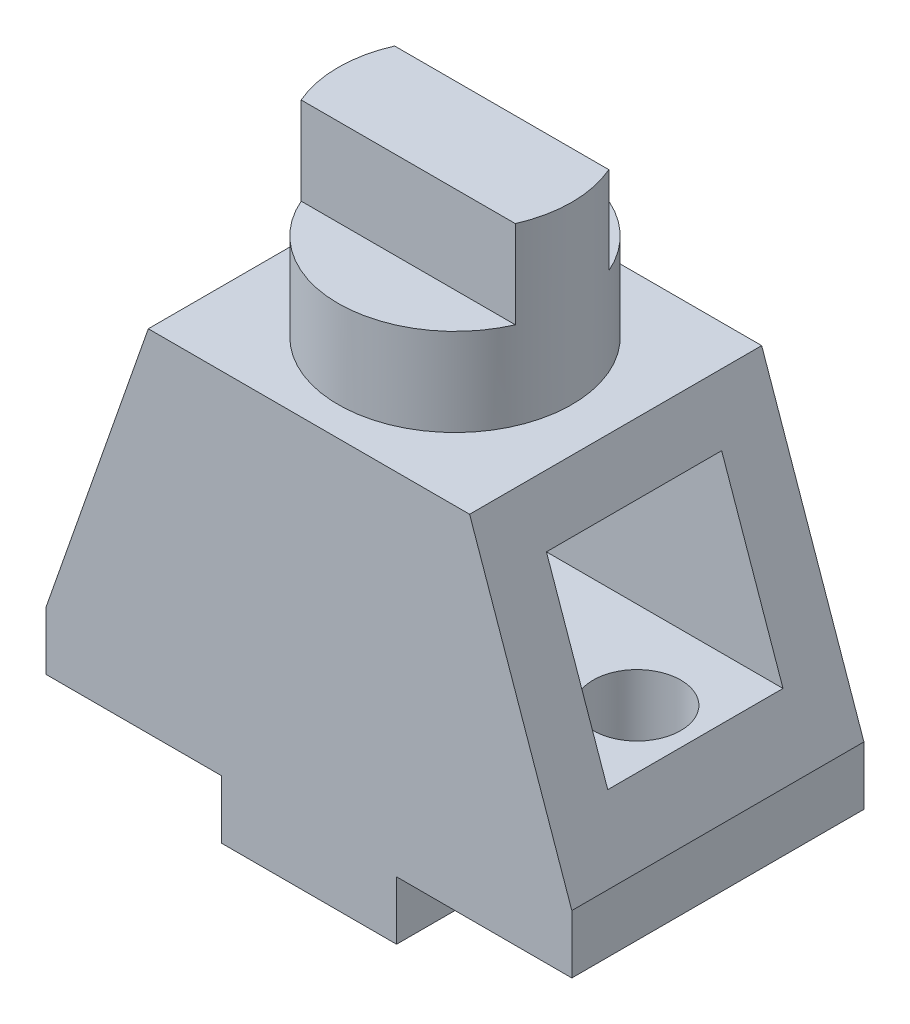
ISO-10303-21;
HEADER;
FILE_DESCRIPTION(('STEP AP214'),'2;1');
FILE_NAME('part.step','',(''),(''),'','','');
FILE_SCHEMA(('AUTOMOTIVE_DESIGN { 1 0 10303 214 1 1 1 1 }'));
ENDSEC;
DATA;
#1=APPLICATION_CONTEXT('core data for automotive mechanical design processes');
#2=APPLICATION_PROTOCOL_DEFINITION('international standard','automotive_design',2000,#1);
#3=PRODUCT_CONTEXT('',#1,'mechanical');
#4=PRODUCT('Part','Part','',(#3));
#5=PRODUCT_RELATED_PRODUCT_CATEGORY('part','',(#4));
#6=PRODUCT_DEFINITION_FORMATION('','',#4);
#7=PRODUCT_DEFINITION_CONTEXT('part definition',#1,'design');
#8=PRODUCT_DEFINITION('design','',#6,#7);
#9=PRODUCT_DEFINITION_SHAPE('','',#8);
#10=(LENGTH_UNIT() NAMED_UNIT(*) SI_UNIT(.MILLI.,.METRE.));
#11=(NAMED_UNIT(*) PLANE_ANGLE_UNIT() SI_UNIT($,.RADIAN.));
#12=(NAMED_UNIT(*) SI_UNIT($,.STERADIAN.) SOLID_ANGLE_UNIT());
#13=UNCERTAINTY_MEASURE_WITH_UNIT(LENGTH_MEASURE(1.E-05),#10,'distance_accuracy_value','');
#14=(GEOMETRIC_REPRESENTATION_CONTEXT(3) GLOBAL_UNCERTAINTY_ASSIGNED_CONTEXT((#13)) GLOBAL_UNIT_ASSIGNED_CONTEXT((#10,
#11,#12)) REPRESENTATION_CONTEXT('',''));
#15=CARTESIAN_POINT('',(0.,0.,0.));
#16=DIRECTION('',(0.,0.,1.));
#17=DIRECTION('',(1.,0.,0.));
#18=AXIS2_PLACEMENT_3D('',#15,#16,#17);
#19=CARTESIAN_POINT('',(0.,100.,25.));
#20=DIRECTION('',(0.,-1.,0.));
#21=DIRECTION('',(0.,0.,-1.));
#22=AXIS2_PLACEMENT_3D('',#19,#20,#21);
#23=CYLINDRICAL_SURFACE('',#22,20.);
#24=CARTESIAN_POINT('',(0.,70.,25.));
#25=DIRECTION('',(0.,-1.,0.));
#26=DIRECTION('',(0.,0.,-1.));
#27=AXIS2_PLACEMENT_3D('',#24,#25,#26);
#28=CIRCLE('',#27,20.);
#29=CARTESIAN_POINT('',(0.,70.,5.));
#30=VERTEX_POINT('',#29);
#31=EDGE_CURVE('E11',#30,#30,#28,.F.);
#32=ORIENTED_EDGE('',*,*,#31,.T.);
#33=EDGE_LOOP('',(#32));
#34=FACE_BOUND('',#33,.T.);
#35=DIRECTION('',(0.,1.,0.));
#36=VECTOR('',#35,1.);
#37=CARTESIAN_POINT('',(-18.3303027798234,85.,33.));
#38=LINE('',#37,#36);
#39=CARTESIAN_POINT('',(-18.3303027798234,85.,33.));
#40=VERTEX_POINT('',#39);
#41=CARTESIAN_POINT('',(-18.3303027798234,100.,33.));
#42=VERTEX_POINT('',#41);
#43=EDGE_CURVE('E158',#40,#42,#38,.T.);
#44=ORIENTED_EDGE('',*,*,#43,.T.);
#45=CARTESIAN_POINT('',(0.,100.,25.));
#46=DIRECTION('',(0.,1.,0.));
#47=DIRECTION('',(0.,0.,1.));
#48=AXIS2_PLACEMENT_3D('',#45,#46,#47);
#49=CIRCLE('',#48,20.);
#50=CARTESIAN_POINT('',(-18.3303027798234,100.,17.));
#51=VERTEX_POINT('',#50);
#52=EDGE_CURVE('E190',#51,#42,#49,.T.);
#53=ORIENTED_EDGE('',*,*,#52,.F.);
#54=DIRECTION('',(0.,1.,0.));
#55=VECTOR('',#54,1.);
#56=CARTESIAN_POINT('',(-18.3303027798234,85.,17.));
#57=LINE('',#56,#55);
#58=CARTESIAN_POINT('',(-18.3303027798234,85.,17.));
#59=VERTEX_POINT('',#58);
#60=EDGE_CURVE('E56',#59,#51,#57,.T.);
#61=ORIENTED_EDGE('',*,*,#60,.F.);
#62=CARTESIAN_POINT('',(0.,85.,25.));
#63=DIRECTION('',(0.,1.,0.));
#64=DIRECTION('',(0.,0.,1.));
#65=AXIS2_PLACEMENT_3D('',#62,#63,#64);
#66=CIRCLE('',#65,20.);
#67=CARTESIAN_POINT('',(18.3303027798234,85.,17.));
#68=VERTEX_POINT('',#67);
#69=EDGE_CURVE('E179',#68,#59,#66,.T.);
#70=ORIENTED_EDGE('',*,*,#69,.F.);
#71=DIRECTION('',(0.,1.,0.));
#72=VECTOR('',#71,1.);
#73=CARTESIAN_POINT('',(18.3303027798234,85.,17.));
#74=LINE('',#73,#72);
#75=CARTESIAN_POINT('',(18.3303027798234,100.,17.));
#76=VERTEX_POINT('',#75);
#77=EDGE_CURVE('E185',#68,#76,#74,.T.);
#78=ORIENTED_EDGE('',*,*,#77,.T.);
#79=CARTESIAN_POINT('',(18.3303027798234,100.,33.));
#80=VERTEX_POINT('',#79);
#81=EDGE_CURVE('E188',#80,#76,#49,.T.);
#82=ORIENTED_EDGE('',*,*,#81,.F.);
#83=DIRECTION('',(0.,1.,0.));
#84=VECTOR('',#83,1.);
#85=CARTESIAN_POINT('',(18.3303027798234,85.,33.));
#86=LINE('',#85,#84);
#87=CARTESIAN_POINT('',(18.3303027798234,85.,33.));
#88=VERTEX_POINT('',#87);
#89=EDGE_CURVE('E48',#88,#80,#86,.T.);
#90=ORIENTED_EDGE('',*,*,#89,.F.);
#91=CARTESIAN_POINT('',(0.,85.,25.));
#92=DIRECTION('',(0.,1.,0.));
#93=DIRECTION('',(0.,0.,1.));
#94=AXIS2_PLACEMENT_3D('',#91,#92,#93);
#95=CIRCLE('',#94,20.);
#96=EDGE_CURVE('E168',#40,#88,#95,.T.);
#97=ORIENTED_EDGE('',*,*,#96,.F.);
#98=EDGE_LOOP('',(#44,#53,#61,#70,#78,#82,#90,#97));
#99=FACE_BOUND('',#98,.T.);
#100=ADVANCED_FACE('F33',(#34,#99),#23,.T.);
#101=CARTESIAN_POINT('',(0.,100.,25.));
#102=DIRECTION('',(0.,1.,0.));
#103=DIRECTION('',(0.,0.,1.));
#104=AXIS2_PLACEMENT_3D('',#101,#102,#103);
#105=PLANE('',#104);
#106=ORIENTED_EDGE('',*,*,#52,.T.);
#107=DIRECTION('',(1.,0.,0.));
#108=VECTOR('',#107,1.);
#109=CARTESIAN_POINT('',(0.,100.,33.));
#110=LINE('',#109,#108);
#111=EDGE_CURVE('E163',#42,#80,#110,.T.);
#112=ORIENTED_EDGE('',*,*,#111,.T.);
#113=ORIENTED_EDGE('',*,*,#81,.T.);
#114=DIRECTION('',(1.,0.,0.));
#115=VECTOR('',#114,1.);
#116=CARTESIAN_POINT('',(0.,100.,17.));
#117=LINE('',#116,#115);
#118=EDGE_CURVE('E177',#51,#76,#117,.T.);
#119=ORIENTED_EDGE('',*,*,#118,.F.);
#120=EDGE_LOOP('',(#106,#112,#113,#119));
#121=FACE_BOUND('',#120,.T.);
#122=ADVANCED_FACE('F348',(#121),#105,.T.);
#123=CARTESIAN_POINT('',(15.,0.,50.));
#124=DIRECTION('',(-1.,0.,0.));
#125=DIRECTION('',(0.,0.,1.));
#126=AXIS2_PLACEMENT_3D('',#123,#124,#125);
#127=PLANE('',#126);
#128=DIRECTION('',(0.,1.,0.));
#129=VECTOR('',#128,1.);
#130=CARTESIAN_POINT('',(15.,0.,0.));
#131=LINE('',#130,#129);
#132=CARTESIAN_POINT('',(15.,0.,0.));
#133=VERTEX_POINT('',#132);
#134=CARTESIAN_POINT('',(15.,10.,0.));
#135=VERTEX_POINT('',#134);
#136=EDGE_CURVE('E223',#133,#135,#131,.T.);
#137=ORIENTED_EDGE('',*,*,#136,.T.);
#138=DIRECTION('',(0.,0.,-1.));
#139=VECTOR('',#138,1.);
#140=CARTESIAN_POINT('',(15.,10.,50.));
#141=LINE('',#140,#139);
#142=CARTESIAN_POINT('',(15.,10.,50.));
#143=VERTEX_POINT('',#142);
#144=EDGE_CURVE('E289',#143,#135,#141,.T.);
#145=ORIENTED_EDGE('',*,*,#144,.F.);
#146=DIRECTION('',(0.,1.,0.));
#147=VECTOR('',#146,1.);
#148=CARTESIAN_POINT('',(15.,0.,50.));
#149=LINE('',#148,#147);
#150=CARTESIAN_POINT('',(15.,0.,50.));
#151=VERTEX_POINT('',#150);
#152=EDGE_CURVE('E227',#151,#143,#149,.T.);
#153=ORIENTED_EDGE('',*,*,#152,.F.);
#154=DIRECTION('',(0.,0.,-1.));
#155=VECTOR('',#154,1.);
#156=CARTESIAN_POINT('',(15.,0.,50.));
#157=LINE('',#156,#155);
#158=EDGE_CURVE('E292',#151,#133,#157,.T.);
#159=ORIENTED_EDGE('',*,*,#158,.T.);
#160=EDGE_LOOP('',(#137,#145,#153,#159));
#161=FACE_BOUND('',#160,.T.);
#162=ADVANCED_FACE('F35',(#161),#127,.F.);
#163=CARTESIAN_POINT('',(15.,10.,50.));
#164=DIRECTION('',(0.,1.,0.));
#165=DIRECTION('',(0.,0.,1.));
#166=AXIS2_PLACEMENT_3D('',#163,#164,#165);
#167=PLANE('',#166);
#168=CARTESIAN_POINT('',(31.15,10.,25.));
#169=DIRECTION('',(0.,1.,0.));
#170=DIRECTION('',(0.,0.,1.));
#171=AXIS2_PLACEMENT_3D('',#168,#169,#170);
#172=CIRCLE('',#171,7.5);
#173=CARTESIAN_POINT('',(31.15,10.,32.5));
#174=VERTEX_POINT('',#173);
#175=EDGE_CURVE('E193',#174,#174,#172,.F.);
#176=ORIENTED_EDGE('',*,*,#175,.F.);
#177=EDGE_LOOP('',(#176));
#178=FACE_BOUND('',#177,.T.);
#179=DIRECTION('',(1.,0.,0.));
#180=VECTOR('',#179,1.);
#181=CARTESIAN_POINT('',(15.,10.,0.));
#182=LINE('',#181,#180);
#183=CARTESIAN_POINT('',(45.,10.,0.));
#184=VERTEX_POINT('',#183);
#185=EDGE_CURVE('E249',#135,#184,#182,.T.);
#186=ORIENTED_EDGE('',*,*,#185,.T.);
#187=DIRECTION('',(0.,0.,-1.));
#188=VECTOR('',#187,1.);
#189=CARTESIAN_POINT('',(45.,10.,50.));
#190=LINE('',#189,#188);
#191=CARTESIAN_POINT('',(45.,10.,50.));
#192=VERTEX_POINT('',#191);
#193=EDGE_CURVE('E286',#192,#184,#190,.T.);
#194=ORIENTED_EDGE('',*,*,#193,.F.);
#195=DIRECTION('',(1.,0.,0.));
#196=VECTOR('',#195,1.);
#197=CARTESIAN_POINT('',(15.,10.,50.));
#198=LINE('',#197,#196);
#199=EDGE_CURVE('E230',#143,#192,#198,.T.);
#200=ORIENTED_EDGE('',*,*,#199,.F.);
#201=ORIENTED_EDGE('',*,*,#144,.T.);
#202=EDGE_LOOP('',(#186,#194,#200,#201));
#203=FACE_BOUND('',#202,.T.);
#204=ADVANCED_FACE('F453',(#178,#203),#167,.F.);
#205=CARTESIAN_POINT('',(45.,10.,50.));
#206=DIRECTION('',(-1.,0.,0.));
#207=DIRECTION('',(0.,0.,1.));
#208=AXIS2_PLACEMENT_3D('',#205,#206,#207);
#209=PLANE('',#208);
#210=DIRECTION('',(0.,1.,0.));
#211=VECTOR('',#210,1.);
#212=CARTESIAN_POINT('',(45.,10.,0.));
#213=LINE('',#212,#211);
#214=CARTESIAN_POINT('',(45.,20.,0.));
#215=VERTEX_POINT('',#214);
#216=EDGE_CURVE('E251',#184,#215,#213,.T.);
#217=ORIENTED_EDGE('',*,*,#216,.T.);
#218=DIRECTION('',(0.,0.,-1.));
#219=VECTOR('',#218,1.);
#220=CARTESIAN_POINT('',(45.,20.,50.));
#221=LINE('',#220,#219);
#222=CARTESIAN_POINT('',(45.,20.,50.));
#223=VERTEX_POINT('',#222);
#224=EDGE_CURVE('E283',#223,#215,#221,.T.);
#225=ORIENTED_EDGE('',*,*,#224,.F.);
#226=DIRECTION('',(0.,1.,0.));
#227=VECTOR('',#226,1.);
#228=CARTESIAN_POINT('',(45.,10.,50.));
#229=LINE('',#228,#227);
#230=EDGE_CURVE('E232',#192,#223,#229,.T.);
#231=ORIENTED_EDGE('',*,*,#230,.F.);
#232=ORIENTED_EDGE('',*,*,#193,.T.);
#233=EDGE_LOOP('',(#217,#225,#231,#232));
#234=FACE_BOUND('',#233,.T.);
#235=ADVANCED_FACE('F457',(#234),#209,.F.);
#236=CARTESIAN_POINT('',(27.5,70.,50.));
#237=DIRECTION('',(-0.943858356366017,-0.330350424728106,0.));
#238=DIRECTION('',(0.330350424728106,-0.943858356366017,0.));
#239=AXIS2_PLACEMENT_3D('',#236,#237,#238);
#240=PLANE('',#239);
#241=DIRECTION('',(0.,0.,-1.));
#242=VECTOR('',#241,1.);
#243=CARTESIAN_POINT('',(30.65,61.,50.));
#244=LINE('',#243,#242);
#245=CARTESIAN_POINT('',(30.65,61.,40.));
#246=VERTEX_POINT('',#245);
#247=CARTESIAN_POINT('',(30.65,61.,10.));
#248=VERTEX_POINT('',#247);
#249=EDGE_CURVE('E204',#246,#248,#244,.T.);
#250=ORIENTED_EDGE('',*,*,#249,.T.);
#251=DIRECTION('',(0.330350424728106,-0.943858356366017,0.));
#252=VECTOR('',#251,1.);
#253=CARTESIAN_POINT('',(27.5,70.,10.));
#254=LINE('',#253,#252);
#255=CARTESIAN_POINT('',(41.15,31.,10.));
#256=VERTEX_POINT('',#255);
#257=EDGE_CURVE('E220',#248,#256,#254,.T.);
#258=ORIENTED_EDGE('',*,*,#257,.T.);
#259=DIRECTION('',(0.,0.,1.));
#260=VECTOR('',#259,1.);
#261=CARTESIAN_POINT('',(41.15,31.,50.));
#262=LINE('',#261,#260);
#263=CARTESIAN_POINT('',(41.15,31.,40.));
#264=VERTEX_POINT('',#263);
#265=EDGE_CURVE('E217',#256,#264,#262,.T.);
#266=ORIENTED_EDGE('',*,*,#265,.T.);
#267=DIRECTION('',(-0.330350424728106,0.943858356366017,0.));
#268=VECTOR('',#267,1.);
#269=CARTESIAN_POINT('',(27.5,70.,40.));
#270=LINE('',#269,#268);
#271=EDGE_CURVE('E214',#264,#246,#270,.T.);
#272=ORIENTED_EDGE('',*,*,#271,.T.);
#273=EDGE_LOOP('',(#250,#258,#266,#272));
#274=FACE_BOUND('',#273,.T.);
#275=DIRECTION('',(-0.330350424728106,0.943858356366017,0.));
#276=VECTOR('',#275,1.);
#277=CARTESIAN_POINT('',(27.5,70.,0.));
#278=LINE('',#277,#276);
#279=CARTESIAN_POINT('',(27.5,70.,0.));
#280=VERTEX_POINT('',#279);
#281=EDGE_CURVE('E253',#215,#280,#278,.T.);
#282=ORIENTED_EDGE('',*,*,#281,.T.);
#283=DIRECTION('',(0.,0.,-1.));
#284=VECTOR('',#283,1.);
#285=CARTESIAN_POINT('',(27.5,70.,50.));
#286=LINE('',#285,#284);
#287=CARTESIAN_POINT('',(27.5,70.,50.));
#288=VERTEX_POINT('',#287);
#289=EDGE_CURVE('E280',#288,#280,#286,.T.);
#290=ORIENTED_EDGE('',*,*,#289,.F.);
#291=DIRECTION('',(-0.330350424728106,0.943858356366017,0.));
#292=VECTOR('',#291,1.);
#293=CARTESIAN_POINT('',(27.5,70.,50.));
#294=LINE('',#293,#292);
#295=EDGE_CURVE('E234',#223,#288,#294,.T.);
#296=ORIENTED_EDGE('',*,*,#295,.F.);
#297=ORIENTED_EDGE('',*,*,#224,.T.);
#298=EDGE_LOOP('',(#282,#290,#296,#297));
#299=FACE_BOUND('',#298,.T.);
#300=ADVANCED_FACE('F331',(#274,#299),#240,.F.);
#301=CARTESIAN_POINT('',(-27.5,70.,50.));
#302=DIRECTION('',(0.,-1.,0.));
#303=DIRECTION('',(0.,0.,-1.));
#304=AXIS2_PLACEMENT_3D('',#301,#302,#303);
#305=PLANE('',#304);
#306=ORIENTED_EDGE('',*,*,#31,.F.);
#307=EDGE_LOOP('',(#306));
#308=FACE_BOUND('',#307,.T.);
#309=DIRECTION('',(-1.,0.,0.));
#310=VECTOR('',#309,1.);
#311=CARTESIAN_POINT('',(-27.5,70.,0.));
#312=LINE('',#311,#310);
#313=CARTESIAN_POINT('',(-27.5,70.,0.));
#314=VERTEX_POINT('',#313);
#315=EDGE_CURVE('E255',#280,#314,#312,.T.);
#316=ORIENTED_EDGE('',*,*,#315,.T.);
#317=DIRECTION('',(0.,0.,-1.));
#318=VECTOR('',#317,1.);
#319=CARTESIAN_POINT('',(-27.5,70.,50.));
#320=LINE('',#319,#318);
#321=CARTESIAN_POINT('',(-27.5,70.,50.));
#322=VERTEX_POINT('',#321);
#323=EDGE_CURVE('E277',#322,#314,#320,.T.);
#324=ORIENTED_EDGE('',*,*,#323,.F.);
#325=DIRECTION('',(-1.,0.,0.));
#326=VECTOR('',#325,1.);
#327=CARTESIAN_POINT('',(-27.5,70.,50.));
#328=LINE('',#327,#326);
#329=EDGE_CURVE('E236',#288,#322,#328,.T.);
#330=ORIENTED_EDGE('',*,*,#329,.F.);
#331=ORIENTED_EDGE('',*,*,#289,.T.);
#332=EDGE_LOOP('',(#316,#324,#330,#331));
#333=FACE_BOUND('',#332,.T.);
#334=ADVANCED_FACE('F404',(#308,#333),#305,.F.);
#335=CARTESIAN_POINT('',(-27.5,70.,50.));
#336=DIRECTION('',(0.943858356366017,-0.330350424728106,0.));
#337=DIRECTION('',(0.330350424728106,0.943858356366017,0.));
#338=AXIS2_PLACEMENT_3D('',#335,#336,#337);
#339=PLANE('',#338);
#340=DIRECTION('',(0.,0.,-1.));
#341=VECTOR('',#340,1.);
#342=CARTESIAN_POINT('',(-41.15,31.,50.));
#343=LINE('',#342,#341);
#344=CARTESIAN_POINT('',(-41.15,31.,40.));
#345=VERTEX_POINT('',#344);
#346=CARTESIAN_POINT('',(-41.15,31.,10.));
#347=VERTEX_POINT('',#346);
#348=EDGE_CURVE('E301',#345,#347,#343,.T.);
#349=ORIENTED_EDGE('',*,*,#348,.T.);
#350=DIRECTION('',(0.330350424728106,0.943858356366017,0.));
#351=VECTOR('',#350,1.);
#352=CARTESIAN_POINT('',(-27.5,70.,10.));
#353=LINE('',#352,#351);
#354=CARTESIAN_POINT('',(-30.65,61.,10.));
#355=VERTEX_POINT('',#354);
#356=EDGE_CURVE('E41',#347,#355,#353,.T.);
#357=ORIENTED_EDGE('',*,*,#356,.T.);
#358=DIRECTION('',(0.,0.,1.));
#359=VECTOR('',#358,1.);
#360=CARTESIAN_POINT('',(-30.65,61.,50.));
#361=LINE('',#360,#359);
#362=CARTESIAN_POINT('',(-30.65,61.,40.));
#363=VERTEX_POINT('',#362);
#364=EDGE_CURVE('E295',#355,#363,#361,.T.);
#365=ORIENTED_EDGE('',*,*,#364,.T.);
#366=DIRECTION('',(-0.330350424728106,-0.943858356366017,0.));
#367=VECTOR('',#366,1.);
#368=CARTESIAN_POINT('',(-27.5,70.,40.));
#369=LINE('',#368,#367);
#370=EDGE_CURVE('E298',#363,#345,#369,.T.);
#371=ORIENTED_EDGE('',*,*,#370,.T.);
#372=EDGE_LOOP('',(#349,#357,#365,#371));
#373=FACE_BOUND('',#372,.T.);
#374=DIRECTION('',(-0.330350424728106,-0.943858356366017,0.));
#375=VECTOR('',#374,1.);
#376=CARTESIAN_POINT('',(-27.5,70.,0.));
#377=LINE('',#376,#375);
#378=CARTESIAN_POINT('',(-45.,20.,0.));
#379=VERTEX_POINT('',#378);
#380=EDGE_CURVE('E257',#314,#379,#377,.T.);
#381=ORIENTED_EDGE('',*,*,#380,.T.);
#382=DIRECTION('',(0.,0.,-1.));
#383=VECTOR('',#382,1.);
#384=CARTESIAN_POINT('',(-45.,20.,50.));
#385=LINE('',#384,#383);
#386=CARTESIAN_POINT('',(-45.,20.,50.));
#387=VERTEX_POINT('',#386);
#388=EDGE_CURVE('E274',#387,#379,#385,.T.);
#389=ORIENTED_EDGE('',*,*,#388,.F.);
#390=DIRECTION('',(-0.330350424728106,-0.943858356366017,0.));
#391=VECTOR('',#390,1.);
#392=CARTESIAN_POINT('',(-27.5,70.,50.));
#393=LINE('',#392,#391);
#394=EDGE_CURVE('E238',#322,#387,#393,.T.);
#395=ORIENTED_EDGE('',*,*,#394,.F.);
#396=ORIENTED_EDGE('',*,*,#323,.T.);
#397=EDGE_LOOP('',(#381,#389,#395,#396));
#398=FACE_BOUND('',#397,.T.);
#399=ADVANCED_FACE('F326',(#373,#398),#339,.F.);
#400=CARTESIAN_POINT('',(-45.,10.,50.));
#401=DIRECTION('',(1.,0.,0.));
#402=DIRECTION('',(0.,0.,-1.));
#403=AXIS2_PLACEMENT_3D('',#400,#401,#402);
#404=PLANE('',#403);
#405=DIRECTION('',(0.,-1.,0.));
#406=VECTOR('',#405,1.);
#407=CARTESIAN_POINT('',(-45.,10.,0.));
#408=LINE('',#407,#406);
#409=CARTESIAN_POINT('',(-45.,10.,0.));
#410=VERTEX_POINT('',#409);
#411=EDGE_CURVE('E259',#379,#410,#408,.T.);
#412=ORIENTED_EDGE('',*,*,#411,.T.);
#413=DIRECTION('',(0.,0.,-1.));
#414=VECTOR('',#413,1.);
#415=CARTESIAN_POINT('',(-45.,10.,50.));
#416=LINE('',#415,#414);
#417=CARTESIAN_POINT('',(-45.,10.,50.));
#418=VERTEX_POINT('',#417);
#419=EDGE_CURVE('E271',#418,#410,#416,.T.);
#420=ORIENTED_EDGE('',*,*,#419,.F.);
#421=DIRECTION('',(0.,-1.,0.));
#422=VECTOR('',#421,1.);
#423=CARTESIAN_POINT('',(-45.,10.,50.));
#424=LINE('',#423,#422);
#425=EDGE_CURVE('E240',#387,#418,#424,.T.);
#426=ORIENTED_EDGE('',*,*,#425,.F.);
#427=ORIENTED_EDGE('',*,*,#388,.T.);
#428=EDGE_LOOP('',(#412,#420,#426,#427));
#429=FACE_BOUND('',#428,.T.);
#430=ADVANCED_FACE('F443',(#429),#404,.F.);
#431=CARTESIAN_POINT('',(-15.,10.,50.));
#432=DIRECTION('',(0.,1.,0.));
#433=DIRECTION('',(0.,0.,1.));
#434=AXIS2_PLACEMENT_3D('',#431,#432,#433);
#435=PLANE('',#434);
#436=CARTESIAN_POINT('',(-31.15,10.,25.));
#437=DIRECTION('',(0.,1.,0.));
#438=DIRECTION('',(0.,0.,1.));
#439=AXIS2_PLACEMENT_3D('',#436,#437,#438);
#440=CIRCLE('',#439,7.5);
#441=CARTESIAN_POINT('',(-31.15,10.,32.5));
#442=VERTEX_POINT('',#441);
#443=EDGE_CURVE('E197',#442,#442,#440,.F.);
#444=ORIENTED_EDGE('',*,*,#443,.F.);
#445=EDGE_LOOP('',(#444));
#446=FACE_BOUND('',#445,.T.);
#447=DIRECTION('',(1.,0.,0.));
#448=VECTOR('',#447,1.);
#449=CARTESIAN_POINT('',(-15.,10.,0.));
#450=LINE('',#449,#448);
#451=CARTESIAN_POINT('',(-15.,10.,0.));
#452=VERTEX_POINT('',#451);
#453=EDGE_CURVE('E261',#410,#452,#450,.T.);
#454=ORIENTED_EDGE('',*,*,#453,.T.);
#455=DIRECTION('',(0.,0.,-1.));
#456=VECTOR('',#455,1.);
#457=CARTESIAN_POINT('',(-15.,10.,50.));
#458=LINE('',#457,#456);
#459=CARTESIAN_POINT('',(-15.,10.,50.));
#460=VERTEX_POINT('',#459);
#461=EDGE_CURVE('E268',#460,#452,#458,.T.);
#462=ORIENTED_EDGE('',*,*,#461,.F.);
#463=DIRECTION('',(1.,0.,0.));
#464=VECTOR('',#463,1.);
#465=CARTESIAN_POINT('',(-15.,10.,50.));
#466=LINE('',#465,#464);
#467=EDGE_CURVE('E242',#418,#460,#466,.T.);
#468=ORIENTED_EDGE('',*,*,#467,.F.);
#469=ORIENTED_EDGE('',*,*,#419,.T.);
#470=EDGE_LOOP('',(#454,#462,#468,#469));
#471=FACE_BOUND('',#470,.T.);
#472=ADVANCED_FACE('F437',(#446,#471),#435,.F.);
#473=CARTESIAN_POINT('',(-15.,0.,50.));
#474=DIRECTION('',(1.,0.,0.));
#475=DIRECTION('',(0.,0.,-1.));
#476=AXIS2_PLACEMENT_3D('',#473,#474,#475);
#477=PLANE('',#476);
#478=DIRECTION('',(0.,-1.,0.));
#479=VECTOR('',#478,1.);
#480=CARTESIAN_POINT('',(-15.,0.,0.));
#481=LINE('',#480,#479);
#482=CARTESIAN_POINT('',(-15.,0.,0.));
#483=VERTEX_POINT('',#482);
#484=EDGE_CURVE('E263',#452,#483,#481,.T.);
#485=ORIENTED_EDGE('',*,*,#484,.T.);
#486=DIRECTION('',(0.,0.,-1.));
#487=VECTOR('',#486,1.);
#488=CARTESIAN_POINT('',(-15.,0.,50.));
#489=LINE('',#488,#487);
#490=CARTESIAN_POINT('',(-15.,0.,50.));
#491=VERTEX_POINT('',#490);
#492=EDGE_CURVE('E247',#491,#483,#489,.T.);
#493=ORIENTED_EDGE('',*,*,#492,.F.);
#494=DIRECTION('',(0.,-1.,0.));
#495=VECTOR('',#494,1.);
#496=CARTESIAN_POINT('',(-15.,0.,50.));
#497=LINE('',#496,#495);
#498=EDGE_CURVE('E244',#460,#491,#497,.T.);
#499=ORIENTED_EDGE('',*,*,#498,.F.);
#500=ORIENTED_EDGE('',*,*,#461,.T.);
#501=EDGE_LOOP('',(#485,#493,#499,#500));
#502=FACE_BOUND('',#501,.T.);
#503=ADVANCED_FACE('F442',(#502),#477,.F.);
#504=CARTESIAN_POINT('',(0.,0.,50.));
#505=DIRECTION('',(0.,1.,0.));
#506=DIRECTION('',(-1.,0.,0.));
#507=AXIS2_PLACEMENT_3D('',#504,#505,#506);
#508=PLANE('',#507);
#509=DIRECTION('',(1.,0.,0.));
#510=VECTOR('',#509,1.);
#511=CARTESIAN_POINT('',(0.,0.,0.));
#512=LINE('',#511,#510);
#513=EDGE_CURVE('E228',#483,#133,#512,.T.);
#514=ORIENTED_EDGE('',*,*,#513,.T.);
#515=ORIENTED_EDGE('',*,*,#158,.F.);
#516=DIRECTION('',(1.,0.,0.));
#517=VECTOR('',#516,1.);
#518=CARTESIAN_POINT('',(0.,0.,50.));
#519=LINE('',#518,#517);
#520=EDGE_CURVE('E224',#491,#151,#519,.T.);
#521=ORIENTED_EDGE('',*,*,#520,.F.);
#522=ORIENTED_EDGE('',*,*,#492,.T.);
#523=EDGE_LOOP('',(#514,#515,#521,#522));
#524=FACE_BOUND('',#523,.T.);
#525=ADVANCED_FACE('F506',(#524),#508,.F.);
#526=CARTESIAN_POINT('',(0.,0.,50.));
#527=DIRECTION('',(0.,0.,1.));
#528=DIRECTION('',(1.,0.,0.));
#529=AXIS2_PLACEMENT_3D('',#526,#527,#528);
#530=PLANE('',#529);
#531=ORIENTED_EDGE('',*,*,#520,.T.);
#532=ORIENTED_EDGE('',*,*,#152,.T.);
#533=ORIENTED_EDGE('',*,*,#199,.T.);
#534=ORIENTED_EDGE('',*,*,#230,.T.);
#535=ORIENTED_EDGE('',*,*,#295,.T.);
#536=ORIENTED_EDGE('',*,*,#329,.T.);
#537=ORIENTED_EDGE('',*,*,#394,.T.);
#538=ORIENTED_EDGE('',*,*,#425,.T.);
#539=ORIENTED_EDGE('',*,*,#467,.T.);
#540=ORIENTED_EDGE('',*,*,#498,.T.);
#541=EDGE_LOOP('',(#531,#532,#533,#534,#535,#536,#537,#538,#539,#540));
#542=FACE_BOUND('',#541,.T.);
#543=ADVANCED_FACE('F496',(#542),#530,.T.);
#544=CARTESIAN_POINT('',(0.,0.,0.));
#545=DIRECTION('',(0.,0.,1.));
#546=DIRECTION('',(1.,0.,0.));
#547=AXIS2_PLACEMENT_3D('',#544,#545,#546);
#548=PLANE('',#547);
#549=ORIENTED_EDGE('',*,*,#136,.F.);
#550=ORIENTED_EDGE('',*,*,#513,.F.);
#551=ORIENTED_EDGE('',*,*,#484,.F.);
#552=ORIENTED_EDGE('',*,*,#453,.F.);
#553=ORIENTED_EDGE('',*,*,#411,.F.);
#554=ORIENTED_EDGE('',*,*,#380,.F.);
#555=ORIENTED_EDGE('',*,*,#315,.F.);
#556=ORIENTED_EDGE('',*,*,#281,.F.);
#557=ORIENTED_EDGE('',*,*,#216,.F.);
#558=ORIENTED_EDGE('',*,*,#185,.F.);
#559=EDGE_LOOP('',(#549,#550,#551,#552,#553,#554,#555,#556,#557,#558));
#560=FACE_BOUND('',#559,.T.);
#561=ADVANCED_FACE('F476',(#560),#548,.F.);
#562=CARTESIAN_POINT('',(-65.,31.,10.));
#563=DIRECTION('',(0.,0.,-1.));
#564=DIRECTION('',(-1.,0.,0.));
#565=AXIS2_PLACEMENT_3D('',#562,#563,#564);
#566=PLANE('',#565);
#567=DIRECTION('',(1.,0.,0.));
#568=VECTOR('',#567,1.);
#569=CARTESIAN_POINT('',(-65.,61.,10.));
#570=LINE('',#569,#568);
#571=EDGE_CURVE('E200',#355,#248,#570,.T.);
#572=ORIENTED_EDGE('',*,*,#571,.F.);
#573=ORIENTED_EDGE('',*,*,#356,.F.);
#574=DIRECTION('',(1.,0.,0.));
#575=VECTOR('',#574,1.);
#576=CARTESIAN_POINT('',(-65.,31.,10.));
#577=LINE('',#576,#575);
#578=EDGE_CURVE('E201',#347,#256,#577,.T.);
#579=ORIENTED_EDGE('',*,*,#578,.T.);
#580=ORIENTED_EDGE('',*,*,#257,.F.);
#581=EDGE_LOOP('',(#572,#573,#579,#580));
#582=FACE_BOUND('',#581,.T.);
#583=ADVANCED_FACE('F317',(#582),#566,.F.);
#584=CARTESIAN_POINT('',(-65.,31.,40.));
#585=DIRECTION('',(0.,-1.,0.));
#586=DIRECTION('',(0.,0.,-1.));
#587=AXIS2_PLACEMENT_3D('',#584,#585,#586);
#588=PLANE('',#587);
#589=CARTESIAN_POINT('',(31.15,31.,25.));
#590=DIRECTION('',(0.,-1.,0.));
#591=DIRECTION('',(0.,0.,-1.));
#592=AXIS2_PLACEMENT_3D('',#589,#590,#591);
#593=CIRCLE('',#592,7.5);
#594=CARTESIAN_POINT('',(31.15,31.,17.5));
#595=VERTEX_POINT('',#594);
#596=EDGE_CURVE('E192',#595,#595,#593,.F.);
#597=ORIENTED_EDGE('',*,*,#596,.F.);
#598=EDGE_LOOP('',(#597));
#599=FACE_BOUND('',#598,.T.);
#600=CARTESIAN_POINT('',(-31.15,31.,25.));
#601=DIRECTION('',(0.,-1.,0.));
#602=DIRECTION('',(0.,0.,-1.));
#603=AXIS2_PLACEMENT_3D('',#600,#601,#602);
#604=CIRCLE('',#603,7.5);
#605=CARTESIAN_POINT('',(-31.15,31.,17.5));
#606=VERTEX_POINT('',#605);
#607=EDGE_CURVE('E196',#606,#606,#604,.F.);
#608=ORIENTED_EDGE('',*,*,#607,.F.);
#609=EDGE_LOOP('',(#608));
#610=FACE_BOUND('',#609,.T.);
#611=ORIENTED_EDGE('',*,*,#578,.F.);
#612=ORIENTED_EDGE('',*,*,#348,.F.);
#613=DIRECTION('',(1.,0.,0.));
#614=VECTOR('',#613,1.);
#615=CARTESIAN_POINT('',(-65.,31.,40.));
#616=LINE('',#615,#614);
#617=EDGE_CURVE('E205',#345,#264,#616,.T.);
#618=ORIENTED_EDGE('',*,*,#617,.T.);
#619=ORIENTED_EDGE('',*,*,#265,.F.);
#620=EDGE_LOOP('',(#611,#612,#618,#619));
#621=FACE_BOUND('',#620,.T.);
#622=ADVANCED_FACE('F313',(#599,#610,#621),#588,.F.);
#623=CARTESIAN_POINT('',(-65.,31.,40.));
#624=DIRECTION('',(0.,0.,1.));
#625=DIRECTION('',(1.,0.,0.));
#626=AXIS2_PLACEMENT_3D('',#623,#624,#625);
#627=PLANE('',#626);
#628=ORIENTED_EDGE('',*,*,#617,.F.);
#629=ORIENTED_EDGE('',*,*,#370,.F.);
#630=DIRECTION('',(1.,0.,0.));
#631=VECTOR('',#630,1.);
#632=CARTESIAN_POINT('',(-65.,61.,40.));
#633=LINE('',#632,#631);
#634=EDGE_CURVE('E208',#363,#246,#633,.T.);
#635=ORIENTED_EDGE('',*,*,#634,.T.);
#636=ORIENTED_EDGE('',*,*,#271,.F.);
#637=EDGE_LOOP('',(#628,#629,#635,#636));
#638=FACE_BOUND('',#637,.T.);
#639=ADVANCED_FACE('F316',(#638),#627,.F.);
#640=CARTESIAN_POINT('',(-65.,61.,40.));
#641=DIRECTION('',(0.,1.,0.));
#642=DIRECTION('',(0.,0.,1.));
#643=AXIS2_PLACEMENT_3D('',#640,#641,#642);
#644=PLANE('',#643);
#645=ORIENTED_EDGE('',*,*,#634,.F.);
#646=ORIENTED_EDGE('',*,*,#364,.F.);
#647=ORIENTED_EDGE('',*,*,#571,.T.);
#648=ORIENTED_EDGE('',*,*,#249,.F.);
#649=EDGE_LOOP('',(#645,#646,#647,#648));
#650=FACE_BOUND('',#649,.T.);
#651=ADVANCED_FACE('F335',(#650),#644,.F.);
#652=CARTESIAN_POINT('',(-31.15,40.,25.));
#653=DIRECTION('',(0.,-1.,0.));
#654=DIRECTION('',(0.,0.,-1.));
#655=AXIS2_PLACEMENT_3D('',#652,#653,#654);
#656=CYLINDRICAL_SURFACE('',#655,7.5);
#657=ORIENTED_EDGE('',*,*,#607,.T.);
#658=EDGE_LOOP('',(#657));
#659=FACE_BOUND('',#658,.T.);
#660=ORIENTED_EDGE('',*,*,#443,.T.);
#661=EDGE_LOOP('',(#660));
#662=FACE_BOUND('',#661,.T.);
#663=ADVANCED_FACE('F337',(#659,#662),#656,.F.);
#664=CARTESIAN_POINT('',(31.15,40.,25.));
#665=DIRECTION('',(0.,-1.,0.));
#666=DIRECTION('',(0.,0.,-1.));
#667=AXIS2_PLACEMENT_3D('',#664,#665,#666);
#668=CYLINDRICAL_SURFACE('',#667,7.5);
#669=ORIENTED_EDGE('',*,*,#596,.T.);
#670=EDGE_LOOP('',(#669));
#671=FACE_BOUND('',#670,.T.);
#672=ORIENTED_EDGE('',*,*,#175,.T.);
#673=EDGE_LOOP('',(#672));
#674=FACE_BOUND('',#673,.T.);
#675=ADVANCED_FACE('F310',(#671,#674),#668,.F.);
#676=CARTESIAN_POINT('',(0.,85.,17.));
#677=DIRECTION('',(0.,0.,1.));
#678=DIRECTION('',(1.,0.,0.));
#679=AXIS2_PLACEMENT_3D('',#676,#677,#678);
#680=PLANE('',#679);
#681=ORIENTED_EDGE('',*,*,#118,.T.);
#682=ORIENTED_EDGE('',*,*,#77,.F.);
#683=DIRECTION('',(1.,0.,0.));
#684=VECTOR('',#683,1.);
#685=CARTESIAN_POINT('',(0.,85.,17.));
#686=LINE('',#685,#684);
#687=EDGE_CURVE('E181',#59,#68,#686,.T.);
#688=ORIENTED_EDGE('',*,*,#687,.F.);
#689=ORIENTED_EDGE('',*,*,#60,.T.);
#690=EDGE_LOOP('',(#681,#682,#688,#689));
#691=FACE_BOUND('',#690,.T.);
#692=ADVANCED_FACE('F359',(#691),#680,.F.);
#693=CARTESIAN_POINT('',(0.,85.,0.));
#694=DIRECTION('',(0.,1.,0.));
#695=DIRECTION('',(0.,0.,1.));
#696=AXIS2_PLACEMENT_3D('',#693,#694,#695);
#697=PLANE('',#696);
#698=ORIENTED_EDGE('',*,*,#69,.T.);
#699=ORIENTED_EDGE('',*,*,#687,.T.);
#700=EDGE_LOOP('',(#698,#699));
#701=FACE_BOUND('',#700,.T.);
#702=ADVANCED_FACE('F363',(#701),#697,.T.);
#703=CARTESIAN_POINT('',(0.,85.,33.));
#704=DIRECTION('',(0.,0.,1.));
#705=DIRECTION('',(1.,0.,0.));
#706=AXIS2_PLACEMENT_3D('',#703,#704,#705);
#707=PLANE('',#706);
#708=ORIENTED_EDGE('',*,*,#111,.F.);
#709=ORIENTED_EDGE('',*,*,#43,.F.);
#710=DIRECTION('',(1.,0.,0.));
#711=VECTOR('',#710,1.);
#712=CARTESIAN_POINT('',(0.,85.,33.));
#713=LINE('',#712,#711);
#714=EDGE_CURVE('E161',#40,#88,#713,.T.);
#715=ORIENTED_EDGE('',*,*,#714,.T.);
#716=ORIENTED_EDGE('',*,*,#89,.T.);
#717=EDGE_LOOP('',(#708,#709,#715,#716));
#718=FACE_BOUND('',#717,.T.);
#719=ADVANCED_FACE('F160',(#718),#707,.T.);
#720=CARTESIAN_POINT('',(0.,85.,0.));
#721=DIRECTION('',(0.,1.,0.));
#722=DIRECTION('',(0.,0.,1.));
#723=AXIS2_PLACEMENT_3D('',#720,#721,#722);
#724=PLANE('',#723);
#725=ORIENTED_EDGE('',*,*,#714,.F.);
#726=ORIENTED_EDGE('',*,*,#96,.T.);
#727=EDGE_LOOP('',(#725,#726));
#728=FACE_BOUND('',#727,.T.);
#729=ADVANCED_FACE('F171',(#728),#724,.T.);
#730=CLOSED_SHELL('',(#100,#122,#162,#204,#235,#300,#334,#399,#430,#472,#503,#525,#543,#561,
#583,#622,#639,#651,#663,#675,#692,#702,#719,#729));
#731=MANIFOLD_SOLID_BREP('B2',#730);
#732=ADVANCED_BREP_SHAPE_REPRESENTATION('',(#18,#731),#14);
#733=SHAPE_DEFINITION_REPRESENTATION(#9,#732);
ENDSEC;
END-ISO-10303-21;
